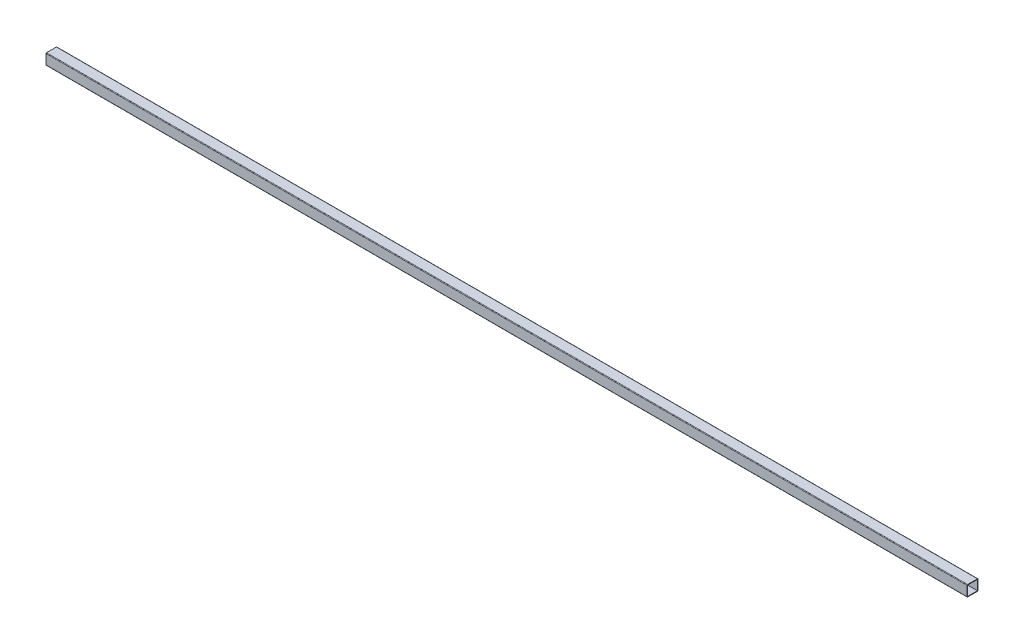
ISO-10303-21;
HEADER;
FILE_DESCRIPTION(('STEP AP214'),'2;1');
FILE_NAME('part.step','',(''),(''),'','','');
FILE_SCHEMA(('AUTOMOTIVE_DESIGN { 1 0 10303 214 1 1 1 1 }'));
ENDSEC;
DATA;
#1=APPLICATION_CONTEXT('core data for automotive mechanical design processes');
#2=APPLICATION_PROTOCOL_DEFINITION('international standard','automotive_design',2000,#1);
#3=PRODUCT_CONTEXT('',#1,'mechanical');
#4=PRODUCT('Part','Part','',(#3));
#5=PRODUCT_RELATED_PRODUCT_CATEGORY('part','',(#4));
#6=PRODUCT_DEFINITION_FORMATION('','',#4);
#7=PRODUCT_DEFINITION_CONTEXT('part definition',#1,'design');
#8=PRODUCT_DEFINITION('design','',#6,#7);
#9=PRODUCT_DEFINITION_SHAPE('','',#8);
#10=(LENGTH_UNIT() NAMED_UNIT(*) SI_UNIT(.MILLI.,.METRE.));
#11=(NAMED_UNIT(*) PLANE_ANGLE_UNIT() SI_UNIT($,.RADIAN.));
#12=(NAMED_UNIT(*) SI_UNIT($,.STERADIAN.) SOLID_ANGLE_UNIT());
#13=UNCERTAINTY_MEASURE_WITH_UNIT(LENGTH_MEASURE(1.E-05),#10,'distance_accuracy_value','');
#14=(GEOMETRIC_REPRESENTATION_CONTEXT(3) GLOBAL_UNCERTAINTY_ASSIGNED_CONTEXT((#13)) GLOBAL_UNIT_ASSIGNED_CONTEXT((#10,
#11,#12)) REPRESENTATION_CONTEXT('',''));
#15=CARTESIAN_POINT('',(0.,0.,0.));
#16=DIRECTION('',(0.,0.,1.));
#17=DIRECTION('',(1.,0.,0.));
#18=AXIS2_PLACEMENT_3D('',#15,#16,#17);
#19=CARTESIAN_POINT('',(5080.,26.999,26.999));
#20=DIRECTION('',(-1.,0.,0.));
#21=DIRECTION('',(0.,0.,1.));
#22=AXIS2_PLACEMENT_3D('',#19,#20,#21);
#23=CYLINDRICAL_SURFACE('',#22,3.001);
#24=CARTESIAN_POINT('',(0.,26.999,26.999));
#25=DIRECTION('',(1.,0.,0.));
#26=DIRECTION('',(0.,0.,-1.));
#27=AXIS2_PLACEMENT_3D('',#24,#25,#26);
#28=CIRCLE('',#27,3.001);
#29=CARTESIAN_POINT('',(0.,30.,26.999));
#30=VERTEX_POINT('',#29);
#31=CARTESIAN_POINT('',(0.,26.999,30.));
#32=VERTEX_POINT('',#31);
#33=EDGE_CURVE('E232',#30,#32,#28,.T.);
#34=ORIENTED_EDGE('',*,*,#33,.T.);
#35=DIRECTION('',(-1.,0.,0.));
#36=VECTOR('',#35,1.);
#37=CARTESIAN_POINT('',(5080.,26.999,30.));
#38=LINE('',#37,#36);
#39=CARTESIAN_POINT('',(5080.,26.999,30.));
#40=VERTEX_POINT('',#39);
#41=EDGE_CURVE('E12',#40,#32,#38,.T.);
#42=ORIENTED_EDGE('',*,*,#41,.F.);
#43=CARTESIAN_POINT('',(5080.,26.999,26.999));
#44=DIRECTION('',(1.,0.,0.));
#45=DIRECTION('',(0.,0.,-1.));
#46=AXIS2_PLACEMENT_3D('',#43,#44,#45);
#47=CIRCLE('',#46,3.001);
#48=CARTESIAN_POINT('',(5080.,30.,26.999));
#49=VERTEX_POINT('',#48);
#50=EDGE_CURVE('E310',#49,#40,#47,.T.);
#51=ORIENTED_EDGE('',*,*,#50,.F.);
#52=DIRECTION('',(-1.,0.,0.));
#53=VECTOR('',#52,1.);
#54=CARTESIAN_POINT('',(5080.,30.,26.999));
#55=LINE('',#54,#53);
#56=EDGE_CURVE('E247',#49,#30,#55,.T.);
#57=ORIENTED_EDGE('',*,*,#56,.T.);
#58=EDGE_LOOP('',(#34,#42,#51,#57));
#59=FACE_BOUND('',#58,.T.);
#60=ADVANCED_FACE('F60',(#59),#23,.T.);
#61=CARTESIAN_POINT('',(5080.,26.999,30.));
#62=DIRECTION('',(0.,0.,-1.));
#63=DIRECTION('',(-1.,0.,0.));
#64=AXIS2_PLACEMENT_3D('',#61,#62,#63);
#65=PLANE('',#64);
#66=DIRECTION('',(0.,-1.,0.));
#67=VECTOR('',#66,1.);
#68=CARTESIAN_POINT('',(0.,26.999,30.));
#69=LINE('',#68,#67);
#70=CARTESIAN_POINT('',(0.,-26.999,30.));
#71=VERTEX_POINT('',#70);
#72=EDGE_CURVE('E235',#32,#71,#69,.T.);
#73=ORIENTED_EDGE('',*,*,#72,.T.);
#74=DIRECTION('',(-1.,0.,0.));
#75=VECTOR('',#74,1.);
#76=CARTESIAN_POINT('',(5080.,-26.999,30.));
#77=LINE('',#76,#75);
#78=CARTESIAN_POINT('',(5080.,-26.999,30.));
#79=VERTEX_POINT('',#78);
#80=EDGE_CURVE('E70',#79,#71,#77,.T.);
#81=ORIENTED_EDGE('',*,*,#80,.F.);
#82=DIRECTION('',(0.,-1.,0.));
#83=VECTOR('',#82,1.);
#84=CARTESIAN_POINT('',(5080.,26.999,30.));
#85=LINE('',#84,#83);
#86=EDGE_CURVE('E312',#40,#79,#85,.T.);
#87=ORIENTED_EDGE('',*,*,#86,.F.);
#88=ORIENTED_EDGE('',*,*,#41,.T.);
#89=EDGE_LOOP('',(#73,#81,#87,#88));
#90=FACE_BOUND('',#89,.T.);
#91=ADVANCED_FACE('F347',(#90),#65,.F.);
#92=CARTESIAN_POINT('',(5080.,-26.999,26.999));
#93=DIRECTION('',(-1.,0.,0.));
#94=DIRECTION('',(0.,0.,1.));
#95=AXIS2_PLACEMENT_3D('',#92,#93,#94);
#96=CYLINDRICAL_SURFACE('',#95,3.001);
#97=CARTESIAN_POINT('',(0.,-26.999,26.999));
#98=DIRECTION('',(1.,0.,0.));
#99=DIRECTION('',(0.,0.,-1.));
#100=AXIS2_PLACEMENT_3D('',#97,#98,#99);
#101=CIRCLE('',#100,3.001);
#102=CARTESIAN_POINT('',(0.,-30.,26.999));
#103=VERTEX_POINT('',#102);
#104=EDGE_CURVE('E237',#71,#103,#101,.T.);
#105=ORIENTED_EDGE('',*,*,#104,.T.);
#106=DIRECTION('',(-1.,0.,0.));
#107=VECTOR('',#106,1.);
#108=CARTESIAN_POINT('',(5080.,-30.,26.999));
#109=LINE('',#108,#107);
#110=CARTESIAN_POINT('',(5080.,-30.,26.999));
#111=VERTEX_POINT('',#110);
#112=EDGE_CURVE('E254',#111,#103,#109,.T.);
#113=ORIENTED_EDGE('',*,*,#112,.F.);
#114=CARTESIAN_POINT('',(5080.,-26.999,26.999));
#115=DIRECTION('',(1.,0.,0.));
#116=DIRECTION('',(0.,0.,-1.));
#117=AXIS2_PLACEMENT_3D('',#114,#115,#116);
#118=CIRCLE('',#117,3.001);
#119=EDGE_CURVE('E314',#79,#111,#118,.T.);
#120=ORIENTED_EDGE('',*,*,#119,.F.);
#121=ORIENTED_EDGE('',*,*,#80,.T.);
#122=EDGE_LOOP('',(#105,#113,#120,#121));
#123=FACE_BOUND('',#122,.T.);
#124=ADVANCED_FACE('F352',(#123),#96,.T.);
#125=CARTESIAN_POINT('',(5080.,-30.,-26.999));
#126=DIRECTION('',(0.,1.,0.));
#127=DIRECTION('',(0.,0.,1.));
#128=AXIS2_PLACEMENT_3D('',#125,#126,#127);
#129=PLANE('',#128);
#130=DIRECTION('',(0.,0.,-1.));
#131=VECTOR('',#130,1.);
#132=CARTESIAN_POINT('',(0.,-30.,-26.999));
#133=LINE('',#132,#131);
#134=CARTESIAN_POINT('',(0.,-30.,-26.999));
#135=VERTEX_POINT('',#134);
#136=EDGE_CURVE('E239',#103,#135,#133,.T.);
#137=ORIENTED_EDGE('',*,*,#136,.T.);
#138=DIRECTION('',(-1.,0.,0.));
#139=VECTOR('',#138,1.);
#140=CARTESIAN_POINT('',(5080.,-30.,-26.999));
#141=LINE('',#140,#139);
#142=CARTESIAN_POINT('',(5080.,-30.,-26.999));
#143=VERTEX_POINT('',#142);
#144=EDGE_CURVE('E251',#143,#135,#141,.T.);
#145=ORIENTED_EDGE('',*,*,#144,.F.);
#146=DIRECTION('',(0.,0.,-1.));
#147=VECTOR('',#146,1.);
#148=CARTESIAN_POINT('',(5080.,-30.,-26.999));
#149=LINE('',#148,#147);
#150=EDGE_CURVE('E316',#111,#143,#149,.T.);
#151=ORIENTED_EDGE('',*,*,#150,.F.);
#152=ORIENTED_EDGE('',*,*,#112,.T.);
#153=EDGE_LOOP('',(#137,#145,#151,#152));
#154=FACE_BOUND('',#153,.T.);
#155=ADVANCED_FACE('F322',(#154),#129,.F.);
#156=CARTESIAN_POINT('',(5080.,-26.999,-26.999));
#157=DIRECTION('',(-1.,0.,0.));
#158=DIRECTION('',(0.,0.,1.));
#159=AXIS2_PLACEMENT_3D('',#156,#157,#158);
#160=CYLINDRICAL_SURFACE('',#159,3.001);
#161=CARTESIAN_POINT('',(0.,-26.999,-26.999));
#162=DIRECTION('',(1.,0.,0.));
#163=DIRECTION('',(0.,0.,-1.));
#164=AXIS2_PLACEMENT_3D('',#161,#162,#163);
#165=CIRCLE('',#164,3.001);
#166=CARTESIAN_POINT('',(0.,-26.999,-30.));
#167=VERTEX_POINT('',#166);
#168=EDGE_CURVE('E241',#135,#167,#165,.T.);
#169=ORIENTED_EDGE('',*,*,#168,.T.);
#170=DIRECTION('',(-1.,0.,0.));
#171=VECTOR('',#170,1.);
#172=CARTESIAN_POINT('',(5080.,-26.999,-30.));
#173=LINE('',#172,#171);
#174=CARTESIAN_POINT('',(5080.,-26.999,-30.));
#175=VERTEX_POINT('',#174);
#176=EDGE_CURVE('E199',#175,#167,#173,.T.);
#177=ORIENTED_EDGE('',*,*,#176,.F.);
#178=CARTESIAN_POINT('',(5080.,-26.999,-26.999));
#179=DIRECTION('',(1.,0.,0.));
#180=DIRECTION('',(0.,0.,-1.));
#181=AXIS2_PLACEMENT_3D('',#178,#179,#180);
#182=CIRCLE('',#181,3.001);
#183=EDGE_CURVE('E190',#143,#175,#182,.T.);
#184=ORIENTED_EDGE('',*,*,#183,.F.);
#185=ORIENTED_EDGE('',*,*,#144,.T.);
#186=EDGE_LOOP('',(#169,#177,#184,#185));
#187=FACE_BOUND('',#186,.T.);
#188=ADVANCED_FACE('F326',(#187),#160,.T.);
#189=CARTESIAN_POINT('',(5080.,-26.999,-30.));
#190=DIRECTION('',(0.,0.,1.));
#191=DIRECTION('',(1.,0.,0.));
#192=AXIS2_PLACEMENT_3D('',#189,#190,#191);
#193=PLANE('',#192);
#194=DIRECTION('',(0.,1.,0.));
#195=VECTOR('',#194,1.);
#196=CARTESIAN_POINT('',(0.,-26.999,-30.));
#197=LINE('',#196,#195);
#198=CARTESIAN_POINT('',(0.,26.999,-30.));
#199=VERTEX_POINT('',#198);
#200=EDGE_CURVE('E198',#167,#199,#197,.T.);
#201=ORIENTED_EDGE('',*,*,#200,.T.);
#202=DIRECTION('',(-1.,0.,0.));
#203=VECTOR('',#202,1.);
#204=CARTESIAN_POINT('',(5080.,26.999,-30.));
#205=LINE('',#204,#203);
#206=CARTESIAN_POINT('',(5080.,26.999,-30.));
#207=VERTEX_POINT('',#206);
#208=EDGE_CURVE('E195',#207,#199,#205,.T.);
#209=ORIENTED_EDGE('',*,*,#208,.F.);
#210=DIRECTION('',(0.,1.,0.));
#211=VECTOR('',#210,1.);
#212=CARTESIAN_POINT('',(5080.,-26.999,-30.));
#213=LINE('',#212,#211);
#214=EDGE_CURVE('E184',#175,#207,#213,.T.);
#215=ORIENTED_EDGE('',*,*,#214,.F.);
#216=ORIENTED_EDGE('',*,*,#176,.T.);
#217=EDGE_LOOP('',(#201,#209,#215,#216));
#218=FACE_BOUND('',#217,.T.);
#219=ADVANCED_FACE('F196',(#218),#193,.F.);
#220=CARTESIAN_POINT('',(5080.,26.999,-26.999));
#221=DIRECTION('',(-1.,0.,0.));
#222=DIRECTION('',(0.,0.,1.));
#223=AXIS2_PLACEMENT_3D('',#220,#221,#222);
#224=CYLINDRICAL_SURFACE('',#223,3.001);
#225=CARTESIAN_POINT('',(0.,26.999,-26.999));
#226=DIRECTION('',(1.,0.,0.));
#227=DIRECTION('',(0.,0.,-1.));
#228=AXIS2_PLACEMENT_3D('',#225,#226,#227);
#229=CIRCLE('',#228,3.001);
#230=CARTESIAN_POINT('',(0.,30.,-26.999));
#231=VERTEX_POINT('',#230);
#232=EDGE_CURVE('E132',#199,#231,#229,.T.);
#233=ORIENTED_EDGE('',*,*,#232,.T.);
#234=DIRECTION('',(-1.,0.,0.));
#235=VECTOR('',#234,1.);
#236=CARTESIAN_POINT('',(5080.,30.,-26.999));
#237=LINE('',#236,#235);
#238=CARTESIAN_POINT('',(5080.,30.,-26.999));
#239=VERTEX_POINT('',#238);
#240=EDGE_CURVE('E200',#239,#231,#237,.T.);
#241=ORIENTED_EDGE('',*,*,#240,.F.);
#242=CARTESIAN_POINT('',(5080.,26.999,-26.999));
#243=DIRECTION('',(1.,0.,0.));
#244=DIRECTION('',(0.,0.,-1.));
#245=AXIS2_PLACEMENT_3D('',#242,#243,#244);
#246=CIRCLE('',#245,3.001);
#247=EDGE_CURVE('E188',#207,#239,#246,.T.);
#248=ORIENTED_EDGE('',*,*,#247,.F.);
#249=ORIENTED_EDGE('',*,*,#208,.T.);
#250=EDGE_LOOP('',(#233,#241,#248,#249));
#251=FACE_BOUND('',#250,.T.);
#252=ADVANCED_FACE('F202',(#251),#224,.T.);
#253=CARTESIAN_POINT('',(5080.,-26.999,26.999));
#254=DIRECTION('',(-1.,0.,0.));
#255=DIRECTION('',(0.,0.,1.));
#256=AXIS2_PLACEMENT_3D('',#253,#254,#255);
#257=CYLINDRICAL_SURFACE('',#256,0.000999999999997531);
#258=CARTESIAN_POINT('',(0.,-26.999,26.999));
#259=DIRECTION('',(1.,0.,0.));
#260=DIRECTION('',(0.,0.,-1.));
#261=AXIS2_PLACEMENT_3D('',#258,#259,#260);
#262=CIRCLE('',#261,0.000999999999997531);
#263=CARTESIAN_POINT('',(0.,-26.999,27.));
#264=VERTEX_POINT('',#263);
#265=CARTESIAN_POINT('',(0.,-27.,26.999));
#266=VERTEX_POINT('',#265);
#267=EDGE_CURVE('E208',#264,#266,#262,.T.);
#268=ORIENTED_EDGE('',*,*,#267,.F.);
#269=DIRECTION('',(-1.,0.,0.));
#270=VECTOR('',#269,1.);
#271=CARTESIAN_POINT('',(5080.,-26.999,27.));
#272=LINE('',#271,#270);
#273=CARTESIAN_POINT('',(5080.,-26.999,27.));
#274=VERTEX_POINT('',#273);
#275=EDGE_CURVE('E64',#274,#264,#272,.T.);
#276=ORIENTED_EDGE('',*,*,#275,.F.);
#277=CARTESIAN_POINT('',(5080.,-26.999,26.999));
#278=DIRECTION('',(1.,0.,0.));
#279=DIRECTION('',(0.,0.,-1.));
#280=AXIS2_PLACEMENT_3D('',#277,#278,#279);
#281=CIRCLE('',#280,0.000999999999997531);
#282=CARTESIAN_POINT('',(5080.,-27.,26.999));
#283=VERTEX_POINT('',#282);
#284=EDGE_CURVE('E246',#274,#283,#281,.T.);
#285=ORIENTED_EDGE('',*,*,#284,.T.);
#286=DIRECTION('',(-1.,0.,0.));
#287=VECTOR('',#286,1.);
#288=CARTESIAN_POINT('',(5080.,-27.,26.999));
#289=LINE('',#288,#287);
#290=EDGE_CURVE('E204',#283,#266,#289,.T.);
#291=ORIENTED_EDGE('',*,*,#290,.T.);
#292=EDGE_LOOP('',(#268,#276,#285,#291));
#293=FACE_BOUND('',#292,.T.);
#294=ADVANCED_FACE('F62',(#293),#257,.F.);
#295=CARTESIAN_POINT('',(5080.,26.999,27.));
#296=DIRECTION('',(0.,0.,-1.));
#297=DIRECTION('',(-1.,0.,0.));
#298=AXIS2_PLACEMENT_3D('',#295,#296,#297);
#299=PLANE('',#298);
#300=DIRECTION('',(0.,-1.,0.));
#301=VECTOR('',#300,1.);
#302=CARTESIAN_POINT('',(0.,26.999,27.));
#303=LINE('',#302,#301);
#304=CARTESIAN_POINT('',(0.,26.999,27.));
#305=VERTEX_POINT('',#304);
#306=EDGE_CURVE('E211',#305,#264,#303,.T.);
#307=ORIENTED_EDGE('',*,*,#306,.F.);
#308=DIRECTION('',(-1.,0.,0.));
#309=VECTOR('',#308,1.);
#310=CARTESIAN_POINT('',(5080.,26.999,27.));
#311=LINE('',#310,#309);
#312=CARTESIAN_POINT('',(5080.,26.999,27.));
#313=VERTEX_POINT('',#312);
#314=EDGE_CURVE('E269',#313,#305,#311,.T.);
#315=ORIENTED_EDGE('',*,*,#314,.F.);
#316=DIRECTION('',(0.,-1.,0.));
#317=VECTOR('',#316,1.);
#318=CARTESIAN_POINT('',(5080.,26.999,27.));
#319=LINE('',#318,#317);
#320=EDGE_CURVE('E278',#313,#274,#319,.T.);
#321=ORIENTED_EDGE('',*,*,#320,.T.);
#322=ORIENTED_EDGE('',*,*,#275,.T.);
#323=EDGE_LOOP('',(#307,#315,#321,#322));
#324=FACE_BOUND('',#323,.T.);
#325=ADVANCED_FACE('F276',(#324),#299,.T.);
#326=CARTESIAN_POINT('',(5080.,26.999,26.999));
#327=DIRECTION('',(-1.,0.,0.));
#328=DIRECTION('',(0.,0.,1.));
#329=AXIS2_PLACEMENT_3D('',#326,#327,#328);
#330=CYLINDRICAL_SURFACE('',#329,0.000999999999997531);
#331=CARTESIAN_POINT('',(0.,26.999,26.999));
#332=DIRECTION('',(1.,0.,0.));
#333=DIRECTION('',(0.,0.,-1.));
#334=AXIS2_PLACEMENT_3D('',#331,#332,#333);
#335=CIRCLE('',#334,0.000999999999997531);
#336=CARTESIAN_POINT('',(0.,27.,26.999));
#337=VERTEX_POINT('',#336);
#338=EDGE_CURVE('E214',#337,#305,#335,.T.);
#339=ORIENTED_EDGE('',*,*,#338,.F.);
#340=DIRECTION('',(-1.,0.,0.));
#341=VECTOR('',#340,1.);
#342=CARTESIAN_POINT('',(5080.,27.,26.999));
#343=LINE('',#342,#341);
#344=CARTESIAN_POINT('',(5080.,27.,26.999));
#345=VERTEX_POINT('',#344);
#346=EDGE_CURVE('E268',#345,#337,#343,.T.);
#347=ORIENTED_EDGE('',*,*,#346,.F.);
#348=CARTESIAN_POINT('',(5080.,26.999,26.999));
#349=DIRECTION('',(1.,0.,0.));
#350=DIRECTION('',(0.,0.,-1.));
#351=AXIS2_PLACEMENT_3D('',#348,#349,#350);
#352=CIRCLE('',#351,0.000999999999997531);
#353=EDGE_CURVE('E286',#345,#313,#352,.T.);
#354=ORIENTED_EDGE('',*,*,#353,.T.);
#355=ORIENTED_EDGE('',*,*,#314,.T.);
#356=EDGE_LOOP('',(#339,#347,#354,#355));
#357=FACE_BOUND('',#356,.T.);
#358=ADVANCED_FACE('F284',(#357),#330,.F.);
#359=CARTESIAN_POINT('',(5080.,27.,26.999));
#360=DIRECTION('',(0.,-1.,0.));
#361=DIRECTION('',(0.,0.,-1.));
#362=AXIS2_PLACEMENT_3D('',#359,#360,#361);
#363=PLANE('',#362);
#364=DIRECTION('',(0.,0.,1.));
#365=VECTOR('',#364,1.);
#366=CARTESIAN_POINT('',(0.,27.,26.999));
#367=LINE('',#366,#365);
#368=CARTESIAN_POINT('',(0.,27.,-26.999));
#369=VERTEX_POINT('',#368);
#370=EDGE_CURVE('E217',#369,#337,#367,.T.);
#371=ORIENTED_EDGE('',*,*,#370,.F.);
#372=DIRECTION('',(-1.,0.,0.));
#373=VECTOR('',#372,1.);
#374=CARTESIAN_POINT('',(5080.,27.,-26.999));
#375=LINE('',#374,#373);
#376=CARTESIAN_POINT('',(5080.,27.,-26.999));
#377=VERTEX_POINT('',#376);
#378=EDGE_CURVE('E266',#377,#369,#375,.T.);
#379=ORIENTED_EDGE('',*,*,#378,.F.);
#380=DIRECTION('',(0.,0.,1.));
#381=VECTOR('',#380,1.);
#382=CARTESIAN_POINT('',(5080.,27.,26.999));
#383=LINE('',#382,#381);
#384=EDGE_CURVE('E292',#377,#345,#383,.T.);
#385=ORIENTED_EDGE('',*,*,#384,.T.);
#386=ORIENTED_EDGE('',*,*,#346,.T.);
#387=EDGE_LOOP('',(#371,#379,#385,#386));
#388=FACE_BOUND('',#387,.T.);
#389=ADVANCED_FACE('F295',(#388),#363,.T.);
#390=CARTESIAN_POINT('',(5080.,26.999,-26.999));
#391=DIRECTION('',(-1.,0.,0.));
#392=DIRECTION('',(0.,0.,1.));
#393=AXIS2_PLACEMENT_3D('',#390,#391,#392);
#394=CYLINDRICAL_SURFACE('',#393,0.000999999999999265);
#395=CARTESIAN_POINT('',(0.,26.999,-26.999));
#396=DIRECTION('',(1.,0.,0.));
#397=DIRECTION('',(0.,0.,-1.));
#398=AXIS2_PLACEMENT_3D('',#395,#396,#397);
#399=CIRCLE('',#398,0.000999999999999265);
#400=CARTESIAN_POINT('',(0.,26.999,-27.));
#401=VERTEX_POINT('',#400);
#402=EDGE_CURVE('E220',#401,#369,#399,.T.);
#403=ORIENTED_EDGE('',*,*,#402,.F.);
#404=DIRECTION('',(-1.,0.,0.));
#405=VECTOR('',#404,1.);
#406=CARTESIAN_POINT('',(5080.,26.999,-27.));
#407=LINE('',#406,#405);
#408=CARTESIAN_POINT('',(5080.,26.999,-27.));
#409=VERTEX_POINT('',#408);
#410=EDGE_CURVE('E264',#409,#401,#407,.T.);
#411=ORIENTED_EDGE('',*,*,#410,.F.);
#412=CARTESIAN_POINT('',(5080.,26.999,-26.999));
#413=DIRECTION('',(1.,0.,0.));
#414=DIRECTION('',(0.,0.,-1.));
#415=AXIS2_PLACEMENT_3D('',#412,#413,#414);
#416=CIRCLE('',#415,0.000999999999999265);
#417=EDGE_CURVE('E296',#409,#377,#416,.T.);
#418=ORIENTED_EDGE('',*,*,#417,.T.);
#419=ORIENTED_EDGE('',*,*,#378,.T.);
#420=EDGE_LOOP('',(#403,#411,#418,#419));
#421=FACE_BOUND('',#420,.T.);
#422=ADVANCED_FACE('F363',(#421),#394,.F.);
#423=CARTESIAN_POINT('',(5080.,-26.999,-27.));
#424=DIRECTION('',(0.,0.,1.));
#425=DIRECTION('',(1.,0.,0.));
#426=AXIS2_PLACEMENT_3D('',#423,#424,#425);
#427=PLANE('',#426);
#428=DIRECTION('',(0.,1.,0.));
#429=VECTOR('',#428,1.);
#430=CARTESIAN_POINT('',(0.,-26.999,-27.));
#431=LINE('',#430,#429);
#432=CARTESIAN_POINT('',(0.,-26.999,-27.));
#433=VERTEX_POINT('',#432);
#434=EDGE_CURVE('E223',#433,#401,#431,.T.);
#435=ORIENTED_EDGE('',*,*,#434,.F.);
#436=DIRECTION('',(-1.,0.,0.));
#437=VECTOR('',#436,1.);
#438=CARTESIAN_POINT('',(5080.,-26.999,-27.));
#439=LINE('',#438,#437);
#440=CARTESIAN_POINT('',(5080.,-26.999,-27.));
#441=VERTEX_POINT('',#440);
#442=EDGE_CURVE('E262',#441,#433,#439,.T.);
#443=ORIENTED_EDGE('',*,*,#442,.F.);
#444=DIRECTION('',(0.,1.,0.));
#445=VECTOR('',#444,1.);
#446=CARTESIAN_POINT('',(5080.,-26.999,-27.));
#447=LINE('',#446,#445);
#448=EDGE_CURVE('E298',#441,#409,#447,.T.);
#449=ORIENTED_EDGE('',*,*,#448,.T.);
#450=ORIENTED_EDGE('',*,*,#410,.T.);
#451=EDGE_LOOP('',(#435,#443,#449,#450));
#452=FACE_BOUND('',#451,.T.);
#453=ADVANCED_FACE('F359',(#452),#427,.T.);
#454=CARTESIAN_POINT('',(5080.,-26.999,-26.999));
#455=DIRECTION('',(-1.,0.,0.));
#456=DIRECTION('',(0.,0.,1.));
#457=AXIS2_PLACEMENT_3D('',#454,#455,#456);
#458=CYLINDRICAL_SURFACE('',#457,0.000999999999995796);
#459=CARTESIAN_POINT('',(0.,-26.999,-26.999));
#460=DIRECTION('',(1.,0.,0.));
#461=DIRECTION('',(0.,0.,-1.));
#462=AXIS2_PLACEMENT_3D('',#459,#460,#461);
#463=CIRCLE('',#462,0.000999999999995796);
#464=CARTESIAN_POINT('',(0.,-27.,-26.999));
#465=VERTEX_POINT('',#464);
#466=EDGE_CURVE('E226',#465,#433,#463,.T.);
#467=ORIENTED_EDGE('',*,*,#466,.F.);
#468=DIRECTION('',(-1.,0.,0.));
#469=VECTOR('',#468,1.);
#470=CARTESIAN_POINT('',(5080.,-27.,-26.999));
#471=LINE('',#470,#469);
#472=CARTESIAN_POINT('',(5080.,-27.,-26.999));
#473=VERTEX_POINT('',#472);
#474=EDGE_CURVE('E260',#473,#465,#471,.T.);
#475=ORIENTED_EDGE('',*,*,#474,.F.);
#476=CARTESIAN_POINT('',(5080.,-26.999,-26.999));
#477=DIRECTION('',(1.,0.,0.));
#478=DIRECTION('',(0.,0.,-1.));
#479=AXIS2_PLACEMENT_3D('',#476,#477,#478);
#480=CIRCLE('',#479,0.000999999999995796);
#481=EDGE_CURVE('E304',#473,#441,#480,.T.);
#482=ORIENTED_EDGE('',*,*,#481,.T.);
#483=ORIENTED_EDGE('',*,*,#442,.T.);
#484=EDGE_LOOP('',(#467,#475,#482,#483));
#485=FACE_BOUND('',#484,.T.);
#486=ADVANCED_FACE('F341',(#485),#458,.F.);
#487=CARTESIAN_POINT('',(5080.,-27.,-26.999));
#488=DIRECTION('',(0.,1.,0.));
#489=DIRECTION('',(0.,0.,1.));
#490=AXIS2_PLACEMENT_3D('',#487,#488,#489);
#491=PLANE('',#490);
#492=DIRECTION('',(0.,0.,-1.));
#493=VECTOR('',#492,1.);
#494=CARTESIAN_POINT('',(0.,-27.,-26.999));
#495=LINE('',#494,#493);
#496=EDGE_CURVE('E229',#266,#465,#495,.T.);
#497=ORIENTED_EDGE('',*,*,#496,.F.);
#498=ORIENTED_EDGE('',*,*,#290,.F.);
#499=DIRECTION('',(0.,0.,-1.));
#500=VECTOR('',#499,1.);
#501=CARTESIAN_POINT('',(5080.,-27.,-26.999));
#502=LINE('',#501,#500);
#503=EDGE_CURVE('E307',#283,#473,#502,.T.);
#504=ORIENTED_EDGE('',*,*,#503,.T.);
#505=ORIENTED_EDGE('',*,*,#474,.T.);
#506=EDGE_LOOP('',(#497,#498,#504,#505));
#507=FACE_BOUND('',#506,.T.);
#508=ADVANCED_FACE('F334',(#507),#491,.T.);
#509=CARTESIAN_POINT('',(5080.,30.,26.999));
#510=DIRECTION('',(0.,-1.,0.));
#511=DIRECTION('',(0.,0.,-1.));
#512=AXIS2_PLACEMENT_3D('',#509,#510,#511);
#513=PLANE('',#512);
#514=DIRECTION('',(0.,0.,1.));
#515=VECTOR('',#514,1.);
#516=CARTESIAN_POINT('',(0.,30.,26.999));
#517=LINE('',#516,#515);
#518=EDGE_CURVE('E138',#231,#30,#517,.T.);
#519=ORIENTED_EDGE('',*,*,#518,.T.);
#520=ORIENTED_EDGE('',*,*,#56,.F.);
#521=DIRECTION('',(0.,0.,1.));
#522=VECTOR('',#521,1.);
#523=CARTESIAN_POINT('',(5080.,30.,26.999));
#524=LINE('',#523,#522);
#525=EDGE_CURVE('E79',#239,#49,#524,.T.);
#526=ORIENTED_EDGE('',*,*,#525,.F.);
#527=ORIENTED_EDGE('',*,*,#240,.T.);
#528=EDGE_LOOP('',(#519,#520,#526,#527));
#529=FACE_BOUND('',#528,.T.);
#530=ADVANCED_FACE('F332',(#529),#513,.F.);
#531=CARTESIAN_POINT('',(5080.,26.999,26.999));
#532=DIRECTION('',(1.,0.,0.));
#533=DIRECTION('',(0.,0.,-1.));
#534=AXIS2_PLACEMENT_3D('',#531,#532,#533);
#535=PLANE('',#534);
#536=ORIENTED_EDGE('',*,*,#284,.F.);
#537=ORIENTED_EDGE('',*,*,#320,.F.);
#538=ORIENTED_EDGE('',*,*,#353,.F.);
#539=ORIENTED_EDGE('',*,*,#384,.F.);
#540=ORIENTED_EDGE('',*,*,#417,.F.);
#541=ORIENTED_EDGE('',*,*,#448,.F.);
#542=ORIENTED_EDGE('',*,*,#481,.F.);
#543=ORIENTED_EDGE('',*,*,#503,.F.);
#544=EDGE_LOOP('',(#536,#537,#538,#539,#540,#541,#542,#543));
#545=FACE_BOUND('',#544,.T.);
#546=ORIENTED_EDGE('',*,*,#50,.T.);
#547=ORIENTED_EDGE('',*,*,#86,.T.);
#548=ORIENTED_EDGE('',*,*,#119,.T.);
#549=ORIENTED_EDGE('',*,*,#150,.T.);
#550=ORIENTED_EDGE('',*,*,#183,.T.);
#551=ORIENTED_EDGE('',*,*,#214,.T.);
#552=ORIENTED_EDGE('',*,*,#247,.T.);
#553=ORIENTED_EDGE('',*,*,#525,.T.);
#554=EDGE_LOOP('',(#546,#547,#548,#549,#550,#551,#552,#553));
#555=FACE_BOUND('',#554,.T.);
#556=ADVANCED_FACE('F186',(#545,#555),#535,.T.);
#557=CARTESIAN_POINT('',(0.,26.999,26.999));
#558=DIRECTION('',(1.,0.,0.));
#559=DIRECTION('',(0.,0.,-1.));
#560=AXIS2_PLACEMENT_3D('',#557,#558,#559);
#561=PLANE('',#560);
#562=ORIENTED_EDGE('',*,*,#267,.T.);
#563=ORIENTED_EDGE('',*,*,#496,.T.);
#564=ORIENTED_EDGE('',*,*,#466,.T.);
#565=ORIENTED_EDGE('',*,*,#434,.T.);
#566=ORIENTED_EDGE('',*,*,#402,.T.);
#567=ORIENTED_EDGE('',*,*,#370,.T.);
#568=ORIENTED_EDGE('',*,*,#338,.T.);
#569=ORIENTED_EDGE('',*,*,#306,.T.);
#570=EDGE_LOOP('',(#562,#563,#564,#565,#566,#567,#568,#569));
#571=FACE_BOUND('',#570,.T.);
#572=ORIENTED_EDGE('',*,*,#33,.F.);
#573=ORIENTED_EDGE('',*,*,#518,.F.);
#574=ORIENTED_EDGE('',*,*,#232,.F.);
#575=ORIENTED_EDGE('',*,*,#200,.F.);
#576=ORIENTED_EDGE('',*,*,#168,.F.);
#577=ORIENTED_EDGE('',*,*,#136,.F.);
#578=ORIENTED_EDGE('',*,*,#104,.F.);
#579=ORIENTED_EDGE('',*,*,#72,.F.);
#580=EDGE_LOOP('',(#572,#573,#574,#575,#576,#577,#578,#579));
#581=FACE_BOUND('',#580,.T.);
#582=ADVANCED_FACE('F281',(#571,#581),#561,.F.);
#583=CLOSED_SHELL('',(#60,#91,#124,#155,#188,#219,#252,#294,#325,#358,#389,#422,#453,#486,#508,
#530,#556,#582));
#584=MANIFOLD_SOLID_BREP('B2',#583);
#585=ADVANCED_BREP_SHAPE_REPRESENTATION('',(#18,#584),#14);
#586=SHAPE_DEFINITION_REPRESENTATION(#9,#585);
ENDSEC;
END-ISO-10303-21;
